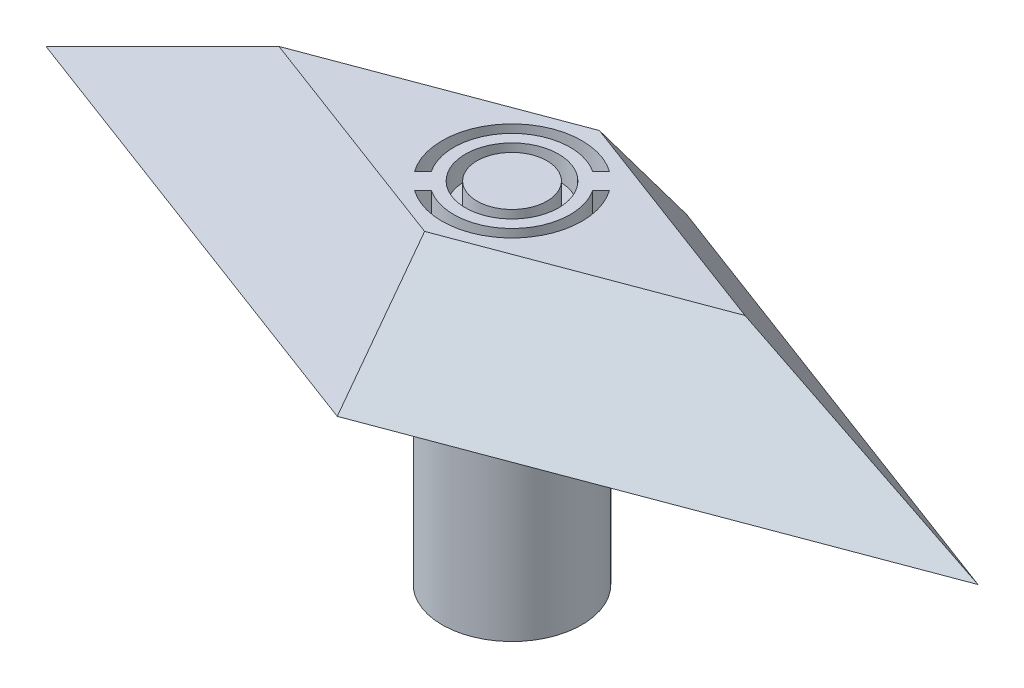
ISO-10303-21;
HEADER;
FILE_DESCRIPTION(('STEP AP214'),'2;1');
FILE_NAME('part.step','',(''),(''),'','','');
FILE_SCHEMA(('AUTOMOTIVE_DESIGN { 1 0 10303 214 1 1 1 1 }'));
ENDSEC;
DATA;
#1=APPLICATION_CONTEXT('core data for automotive mechanical design processes');
#2=APPLICATION_PROTOCOL_DEFINITION('international standard','automotive_design',2000,#1);
#3=PRODUCT_CONTEXT('',#1,'mechanical');
#4=PRODUCT('Part','Part','',(#3));
#5=PRODUCT_RELATED_PRODUCT_CATEGORY('part','',(#4));
#6=PRODUCT_DEFINITION_FORMATION('','',#4);
#7=PRODUCT_DEFINITION_CONTEXT('part definition',#1,'design');
#8=PRODUCT_DEFINITION('design','',#6,#7);
#9=PRODUCT_DEFINITION_SHAPE('','',#8);
#10=(LENGTH_UNIT() NAMED_UNIT(*) SI_UNIT(.MILLI.,.METRE.));
#11=(NAMED_UNIT(*) PLANE_ANGLE_UNIT() SI_UNIT($,.RADIAN.));
#12=(NAMED_UNIT(*) SI_UNIT($,.STERADIAN.) SOLID_ANGLE_UNIT());
#13=UNCERTAINTY_MEASURE_WITH_UNIT(LENGTH_MEASURE(1.E-05),#10,'distance_accuracy_value','');
#14=(GEOMETRIC_REPRESENTATION_CONTEXT(3) GLOBAL_UNCERTAINTY_ASSIGNED_CONTEXT((#13)) GLOBAL_UNIT_ASSIGNED_CONTEXT((#10,
#11,#12)) REPRESENTATION_CONTEXT('',''));
#15=CARTESIAN_POINT('',(0.,0.,0.));
#16=DIRECTION('',(0.,0.,1.));
#17=DIRECTION('',(1.,0.,0.));
#18=AXIS2_PLACEMENT_3D('',#15,#16,#17);
#19=CARTESIAN_POINT('',(0.,5.,0.));
#20=DIRECTION('',(0.,-1.,0.));
#21=DIRECTION('',(1.,0.,0.));
#22=AXIS2_PLACEMENT_3D('',#19,#20,#21);
#23=PLANE('',#22);
#24=CARTESIAN_POINT('',(0.,5.,0.));
#25=DIRECTION('',(0.,-1.,0.));
#26=DIRECTION('',(1.,0.,0.));
#27=AXIS2_PLACEMENT_3D('',#24,#25,#26);
#28=CIRCLE('',#27,2.);
#29=CARTESIAN_POINT('',(2.00000000000004,4.99999999999999,0.));
#30=VERTEX_POINT('',#29);
#31=EDGE_CURVE('E450',#30,#30,#28,.T.);
#32=ORIENTED_EDGE('',*,*,#31,.T.);
#33=EDGE_LOOP('',(#32));
#34=FACE_BOUND('',#33,.T.);
#35=CARTESIAN_POINT('',(0.,5.,0.));
#36=DIRECTION('',(0.,-1.,0.));
#37=DIRECTION('',(1.,0.,0.));
#38=AXIS2_PLACEMENT_3D('',#35,#36,#37);
#39=CIRCLE('',#38,3.);
#40=CARTESIAN_POINT('',(2.4452034569285,4.99999999999998,-1.73809667574192));
#41=VERTEX_POINT('',#40);
#42=CARTESIAN_POINT('',(-1.73809667574188,5.00000000000001,2.44520345692846));
#43=VERTEX_POINT('',#42);
#44=EDGE_CURVE('E69',#41,#43,#39,.T.);
#45=ORIENTED_EDGE('',*,*,#44,.T.);
#46=DIRECTION('',(0.707106781186547,0.,-0.707106781186548));
#47=VECTOR('',#46,1.);
#48=CARTESIAN_POINT('',(-1.37849741697557,5.00000000000001,2.08560419816215));
#49=LINE('',#48,#47);
#50=CARTESIAN_POINT('',(-1.37849741697557,5.00000000000001,2.08560419816215));
#51=VERTEX_POINT('',#50);
#52=EDGE_CURVE('E171',#43,#51,#49,.T.);
#53=ORIENTED_EDGE('',*,*,#52,.T.);
#54=CARTESIAN_POINT('',(0.,5.,0.));
#55=DIRECTION('',(0.,1.,0.));
#56=DIRECTION('',(1.,0.,0.));
#57=AXIS2_PLACEMENT_3D('',#54,#55,#56);
#58=CIRCLE('',#57,2.5);
#59=CARTESIAN_POINT('',(2.08560419816218,4.99999999999999,-1.3784974169756));
#60=VERTEX_POINT('',#59);
#61=EDGE_CURVE('E190',#51,#60,#58,.T.);
#62=ORIENTED_EDGE('',*,*,#61,.T.);
#63=DIRECTION('',(0.707106781186548,0.,-0.707106781186547));
#64=VECTOR('',#63,1.);
#65=CARTESIAN_POINT('',(2.4452034569285,4.99999999999998,-1.73809667574192));
#66=LINE('',#65,#64);
#67=EDGE_CURVE('E181',#60,#41,#66,.T.);
#68=ORIENTED_EDGE('',*,*,#67,.T.);
#69=EDGE_LOOP('',(#45,#53,#62,#68));
#70=FACE_BOUND('',#69,.T.);
#71=DIRECTION('',(0.936329177569045,0.,-0.351123441588392));
#72=VECTOR('',#71,1.);
#73=CARTESIAN_POINT('',(-10.,5.00000000000007,0.));
#74=LINE('',#73,#72);
#75=CARTESIAN_POINT('',(-10.,5.00000000000007,0.));
#76=VERTEX_POINT('',#75);
#77=CARTESIAN_POINT('',(0.,5.,-3.75));
#78=VERTEX_POINT('',#77);
#79=EDGE_CURVE('E313',#76,#78,#74,.T.);
#80=ORIENTED_EDGE('',*,*,#79,.F.);
#81=DIRECTION('',(-0.936329177569045,0.,-0.351123441588392));
#82=VECTOR('',#81,1.);
#83=CARTESIAN_POINT('',(0.,5.,3.75));
#84=LINE('',#83,#82);
#85=CARTESIAN_POINT('',(0.,5.,3.75));
#86=VERTEX_POINT('',#85);
#87=EDGE_CURVE('E12',#86,#76,#84,.T.);
#88=ORIENTED_EDGE('',*,*,#87,.F.);
#89=DIRECTION('',(-0.936329177569045,0.,0.351123441588392));
#90=VECTOR('',#89,1.);
#91=CARTESIAN_POINT('',(10.,4.99999999999993,0.));
#92=LINE('',#91,#90);
#93=CARTESIAN_POINT('',(10.,4.99999999999993,0.));
#94=VERTEX_POINT('',#93);
#95=EDGE_CURVE('E53',#94,#86,#92,.T.);
#96=ORIENTED_EDGE('',*,*,#95,.F.);
#97=DIRECTION('',(0.936329177569045,0.,0.351123441588392));
#98=VECTOR('',#97,1.);
#99=CARTESIAN_POINT('',(0.,5.,-3.75));
#100=LINE('',#99,#98);
#101=EDGE_CURVE('E265',#78,#94,#100,.T.);
#102=ORIENTED_EDGE('',*,*,#101,.F.);
#103=EDGE_LOOP('',(#80,#88,#96,#102));
#104=FACE_BOUND('',#103,.T.);
#105=CARTESIAN_POINT('',(0.,5.,0.));
#106=DIRECTION('',(0.,1.,0.));
#107=DIRECTION('',(1.,0.,0.));
#108=AXIS2_PLACEMENT_3D('',#105,#106,#107);
#109=CIRCLE('',#108,2.5);
#110=CARTESIAN_POINT('',(1.37849741697564,4.99999999999999,-2.08560419816215));
#111=VERTEX_POINT('',#110);
#112=CARTESIAN_POINT('',(-2.08560419816212,5.00000000000002,1.3784974169756));
#113=VERTEX_POINT('',#112);
#114=EDGE_CURVE('E61',#111,#113,#109,.T.);
#115=ORIENTED_EDGE('',*,*,#114,.T.);
#116=DIRECTION('',(-0.707106781186548,0.,0.707106781186547));
#117=VECTOR('',#116,1.);
#118=CARTESIAN_POINT('',(-2.08560419816212,5.00000000000002,1.3784974169756));
#119=LINE('',#118,#117);
#120=CARTESIAN_POINT('',(-2.44520345692843,5.00000000000002,1.73809667574191));
#121=VERTEX_POINT('',#120);
#122=EDGE_CURVE('E168',#113,#121,#119,.T.);
#123=ORIENTED_EDGE('',*,*,#122,.T.);
#124=CARTESIAN_POINT('',(0.,5.,0.));
#125=DIRECTION('',(0.,-1.,0.));
#126=DIRECTION('',(1.,0.,0.));
#127=AXIS2_PLACEMENT_3D('',#124,#125,#126);
#128=CIRCLE('',#127,3.);
#129=CARTESIAN_POINT('',(1.73809667574195,4.99999999999999,-2.44520345692846));
#130=VERTEX_POINT('',#129);
#131=EDGE_CURVE('E462',#121,#130,#128,.T.);
#132=ORIENTED_EDGE('',*,*,#131,.T.);
#133=DIRECTION('',(-0.707106781186548,0.,0.707106781186547));
#134=VECTOR('',#133,1.);
#135=CARTESIAN_POINT('',(1.73809667574195,4.99999999999999,-2.44520345692846));
#136=LINE('',#135,#134);
#137=EDGE_CURVE('E164',#130,#111,#136,.T.);
#138=ORIENTED_EDGE('',*,*,#137,.T.);
#139=EDGE_LOOP('',(#115,#123,#132,#138));
#140=FACE_BOUND('',#139,.T.);
#141=ADVANCED_FACE('F43',(#34,#70,#104,#140),#23,.F.);
#142=CARTESIAN_POINT('',(0.,0.,0.));
#143=DIRECTION('',(0.,-1.,0.));
#144=DIRECTION('',(0.,0.,-1.));
#145=AXIS2_PLACEMENT_3D('',#142,#143,#144);
#146=PLANE('',#145);
#147=CARTESIAN_POINT('',(0.,0.,0.));
#148=DIRECTION('',(0.,1.,0.));
#149=DIRECTION('',(0.,0.,1.));
#150=AXIS2_PLACEMENT_3D('',#147,#148,#149);
#151=CIRCLE('',#150,3.);
#152=CARTESIAN_POINT('',(-2.,0.,2.23606797749979));
#153=VERTEX_POINT('',#152);
#154=CARTESIAN_POINT('',(-2.,0.,-2.23606797749979));
#155=VERTEX_POINT('',#154);
#156=EDGE_CURVE('E202',#153,#155,#151,.T.);
#157=ORIENTED_EDGE('',*,*,#156,.T.);
#158=DIRECTION('',(0.,0.,1.));
#159=VECTOR('',#158,1.);
#160=CARTESIAN_POINT('',(-2.,0.,2.23606797749979));
#161=LINE('',#160,#159);
#162=EDGE_CURVE('E207',#155,#153,#161,.T.);
#163=ORIENTED_EDGE('',*,*,#162,.T.);
#164=EDGE_LOOP('',(#157,#163));
#165=FACE_BOUND('',#164,.T.);
#166=DIRECTION('',(0.936329177569045,0.,0.351123441588392));
#167=VECTOR('',#166,1.);
#168=CARTESIAN_POINT('',(0.,0.,7.5));
#169=LINE('',#168,#167);
#170=CARTESIAN_POINT('',(-20.,0.,0.));
#171=VERTEX_POINT('',#170);
#172=CARTESIAN_POINT('',(0.,0.,7.5));
#173=VERTEX_POINT('',#172);
#174=EDGE_CURVE('E216',#171,#173,#169,.T.);
#175=ORIENTED_EDGE('',*,*,#174,.F.);
#176=DIRECTION('',(-0.936329177569045,0.,0.351123441588392));
#177=VECTOR('',#176,1.);
#178=CARTESIAN_POINT('',(-20.,0.,0.));
#179=LINE('',#178,#177);
#180=CARTESIAN_POINT('',(0.,0.,-7.5));
#181=VERTEX_POINT('',#180);
#182=EDGE_CURVE('E302',#181,#171,#179,.T.);
#183=ORIENTED_EDGE('',*,*,#182,.F.);
#184=DIRECTION('',(-0.936329177569045,0.,-0.351123441588392));
#185=VECTOR('',#184,1.);
#186=CARTESIAN_POINT('',(0.,0.,-7.5));
#187=LINE('',#186,#185);
#188=CARTESIAN_POINT('',(20.,0.,0.));
#189=VERTEX_POINT('',#188);
#190=EDGE_CURVE('E375',#189,#181,#187,.T.);
#191=ORIENTED_EDGE('',*,*,#190,.F.);
#192=DIRECTION('',(0.936329177569045,0.,-0.351123441588392));
#193=VECTOR('',#192,1.);
#194=CARTESIAN_POINT('',(20.,0.,0.));
#195=LINE('',#194,#193);
#196=EDGE_CURVE('E224',#173,#189,#195,.T.);
#197=ORIENTED_EDGE('',*,*,#196,.F.);
#198=EDGE_LOOP('',(#175,#183,#191,#197));
#199=FACE_BOUND('',#198,.T.);
#200=ADVANCED_FACE('F243',(#165,#199),#146,.T.);
#201=CARTESIAN_POINT('',(1.65137614678897,3.30275229357799,4.40366972477065));
#202=DIRECTION('',(-0.287347885566342,-0.574695771132692,-0.766261028176922));
#203=DIRECTION('',(0.,0.8,-0.6));
#204=AXIS2_PLACEMENT_3D('',#201,#202,#203);
#205=PLANE('',#204);
#206=DIRECTION('',(-0.894427190999919,0.447213595499953,0.));
#207=VECTOR('',#206,1.);
#208=CARTESIAN_POINT('',(20.,0.,0.));
#209=LINE('',#208,#207);
#210=EDGE_CURVE('E395',#189,#94,#209,.T.);
#211=ORIENTED_EDGE('',*,*,#210,.T.);
#212=ORIENTED_EDGE('',*,*,#95,.T.);
#213=DIRECTION('',(0.,0.8,-0.6));
#214=VECTOR('',#213,1.);
#215=CARTESIAN_POINT('',(0.,0.,7.5));
#216=LINE('',#215,#214);
#217=EDGE_CURVE('E230',#173,#86,#216,.T.);
#218=ORIENTED_EDGE('',*,*,#217,.F.);
#219=ORIENTED_EDGE('',*,*,#196,.T.);
#220=EDGE_LOOP('',(#211,#212,#218,#219));
#221=FACE_BOUND('',#220,.T.);
#222=ADVANCED_FACE('F232',(#221),#205,.F.);
#223=CARTESIAN_POINT('',(-1.65137614678897,3.30275229357799,4.40366972477065));
#224=DIRECTION('',(-0.287347885566342,0.574695771132691,0.766261028176922));
#225=DIRECTION('',(0.,-0.8,0.6));
#226=AXIS2_PLACEMENT_3D('',#223,#224,#225);
#227=PLANE('',#226);
#228=ORIENTED_EDGE('',*,*,#217,.T.);
#229=ORIENTED_EDGE('',*,*,#87,.T.);
#230=DIRECTION('',(0.894427190999913,0.447213595499963,0.));
#231=VECTOR('',#230,1.);
#232=CARTESIAN_POINT('',(-20.,0.,0.));
#233=LINE('',#232,#231);
#234=EDGE_CURVE('E295',#171,#76,#233,.T.);
#235=ORIENTED_EDGE('',*,*,#234,.F.);
#236=ORIENTED_EDGE('',*,*,#174,.T.);
#237=EDGE_LOOP('',(#228,#229,#235,#236));
#238=FACE_BOUND('',#237,.T.);
#239=ADVANCED_FACE('F242',(#238),#227,.T.);
#240=CARTESIAN_POINT('',(1.65137614678901,3.30275229357798,-4.40366972477063));
#241=DIRECTION('',(0.287347885566349,0.57469577113269,-0.76626102817692));
#242=DIRECTION('',(0.,0.8,0.6));
#243=AXIS2_PLACEMENT_3D('',#240,#241,#242);
#244=PLANE('',#243);
#245=DIRECTION('',(0.,0.8,0.6));
#246=VECTOR('',#245,1.);
#247=CARTESIAN_POINT('',(0.,0.,-7.5));
#248=LINE('',#247,#246);
#249=EDGE_CURVE('E288',#181,#78,#248,.T.);
#250=ORIENTED_EDGE('',*,*,#249,.T.);
#251=ORIENTED_EDGE('',*,*,#101,.T.);
#252=ORIENTED_EDGE('',*,*,#210,.F.);
#253=ORIENTED_EDGE('',*,*,#190,.T.);
#254=EDGE_LOOP('',(#250,#251,#252,#253));
#255=FACE_BOUND('',#254,.T.);
#256=ADVANCED_FACE('F271',(#255),#244,.T.);
#257=CARTESIAN_POINT('',(-1.65137614678901,3.30275229357797,-4.40366972477063));
#258=DIRECTION('',(0.287347885566349,-0.57469577113269,0.766261028176921));
#259=DIRECTION('',(0.,-0.8,-0.6));
#260=AXIS2_PLACEMENT_3D('',#257,#258,#259);
#261=PLANE('',#260);
#262=ORIENTED_EDGE('',*,*,#234,.T.);
#263=ORIENTED_EDGE('',*,*,#79,.T.);
#264=ORIENTED_EDGE('',*,*,#249,.F.);
#265=ORIENTED_EDGE('',*,*,#182,.T.);
#266=EDGE_LOOP('',(#262,#263,#264,#265));
#267=FACE_BOUND('',#266,.T.);
#268=ADVANCED_FACE('F279',(#267),#261,.F.);
#269=CARTESIAN_POINT('',(0.,-10.,0.));
#270=DIRECTION('',(0.,1.,0.));
#271=DIRECTION('',(0.,0.,1.));
#272=AXIS2_PLACEMENT_3D('',#269,#270,#271);
#273=CYLINDRICAL_SURFACE('',#272,3.);
#274=ORIENTED_EDGE('',*,*,#156,.F.);
#275=DIRECTION('',(0.,1.,0.));
#276=VECTOR('',#275,1.);
#277=CARTESIAN_POINT('',(-2.,-10.,2.23606797749979));
#278=LINE('',#277,#276);
#279=CARTESIAN_POINT('',(-2.,-10.,2.23606797749979));
#280=VERTEX_POINT('',#279);
#281=EDGE_CURVE('E213',#280,#153,#278,.T.);
#282=ORIENTED_EDGE('',*,*,#281,.F.);
#283=CARTESIAN_POINT('',(0.,-10.,0.));
#284=DIRECTION('',(0.,1.,0.));
#285=DIRECTION('',(0.,0.,1.));
#286=AXIS2_PLACEMENT_3D('',#283,#284,#285);
#287=CIRCLE('',#286,3.);
#288=CARTESIAN_POINT('',(-2.,-10.,-2.23606797749979));
#289=VERTEX_POINT('',#288);
#290=EDGE_CURVE('E203',#280,#289,#287,.T.);
#291=ORIENTED_EDGE('',*,*,#290,.T.);
#292=DIRECTION('',(0.,1.,0.));
#293=VECTOR('',#292,1.);
#294=CARTESIAN_POINT('',(-2.,-10.,-2.23606797749979));
#295=LINE('',#294,#293);
#296=EDGE_CURVE('E210',#289,#155,#295,.T.);
#297=ORIENTED_EDGE('',*,*,#296,.T.);
#298=EDGE_LOOP('',(#274,#282,#291,#297));
#299=FACE_BOUND('',#298,.T.);
#300=ADVANCED_FACE('F419',(#299),#273,.T.);
#301=CARTESIAN_POINT('',(-2.,-10.,2.23606797749979));
#302=DIRECTION('',(-1.,0.,0.));
#303=DIRECTION('',(0.,0.,1.));
#304=AXIS2_PLACEMENT_3D('',#301,#302,#303);
#305=PLANE('',#304);
#306=ORIENTED_EDGE('',*,*,#162,.F.);
#307=ORIENTED_EDGE('',*,*,#296,.F.);
#308=DIRECTION('',(0.,0.,1.));
#309=VECTOR('',#308,1.);
#310=CARTESIAN_POINT('',(-2.,-10.,2.23606797749979));
#311=LINE('',#310,#309);
#312=EDGE_CURVE('E206',#289,#280,#311,.T.);
#313=ORIENTED_EDGE('',*,*,#312,.T.);
#314=ORIENTED_EDGE('',*,*,#281,.T.);
#315=EDGE_LOOP('',(#306,#307,#313,#314));
#316=FACE_BOUND('',#315,.T.);
#317=ADVANCED_FACE('F423',(#316),#305,.T.);
#318=CARTESIAN_POINT('',(0.,-10.,0.));
#319=DIRECTION('',(0.,1.,0.));
#320=DIRECTION('',(0.,0.,1.));
#321=AXIS2_PLACEMENT_3D('',#318,#319,#320);
#322=PLANE('',#321);
#323=ORIENTED_EDGE('',*,*,#290,.F.);
#324=ORIENTED_EDGE('',*,*,#312,.F.);
#325=EDGE_LOOP('',(#323,#324));
#326=FACE_BOUND('',#325,.T.);
#327=ADVANCED_FACE('F508',(#326),#322,.F.);
#328=CARTESIAN_POINT('',(0.,4.,0.));
#329=DIRECTION('',(0.,1.,0.));
#330=DIRECTION('',(-1.,0.,0.));
#331=AXIS2_PLACEMENT_3D('',#328,#329,#330);
#332=CYLINDRICAL_SURFACE('',#331,3.);
#333=ORIENTED_EDGE('',*,*,#44,.F.);
#334=DIRECTION('',(0.,1.,0.));
#335=VECTOR('',#334,1.);
#336=CARTESIAN_POINT('',(2.44520345692849,3.99999999999998,-1.73809667574192));
#337=LINE('',#336,#335);
#338=CARTESIAN_POINT('',(2.44520345692849,3.99999999999998,-1.73809667574192));
#339=VERTEX_POINT('',#338);
#340=EDGE_CURVE('E186',#339,#41,#337,.T.);
#341=ORIENTED_EDGE('',*,*,#340,.F.);
#342=CARTESIAN_POINT('',(0.,4.,0.));
#343=DIRECTION('',(0.,-1.,0.));
#344=DIRECTION('',(1.,0.,0.));
#345=AXIS2_PLACEMENT_3D('',#342,#343,#344);
#346=CIRCLE('',#345,3.);
#347=CARTESIAN_POINT('',(-1.73809667574189,4.00000000000001,2.44520345692846));
#348=VERTEX_POINT('',#347);
#349=EDGE_CURVE('E177',#339,#348,#346,.T.);
#350=ORIENTED_EDGE('',*,*,#349,.T.);
#351=DIRECTION('',(0.,1.,0.));
#352=VECTOR('',#351,1.);
#353=CARTESIAN_POINT('',(-1.73809667574189,4.00000000000001,2.44520345692846));
#354=LINE('',#353,#352);
#355=EDGE_CURVE('E200',#348,#43,#354,.T.);
#356=ORIENTED_EDGE('',*,*,#355,.T.);
#357=EDGE_LOOP('',(#333,#341,#350,#356));
#358=FACE_BOUND('',#357,.T.);
#359=ADVANCED_FACE('F504',(#358),#332,.F.);
#360=CARTESIAN_POINT('',(-1.37849741697558,4.00000000000001,2.08560419816215));
#361=DIRECTION('',(0.707106781186548,0.,0.707106781186547));
#362=DIRECTION('',(0.707106781186547,0.,-0.707106781186548));
#363=AXIS2_PLACEMENT_3D('',#360,#361,#362);
#364=PLANE('',#363);
#365=ORIENTED_EDGE('',*,*,#52,.F.);
#366=ORIENTED_EDGE('',*,*,#355,.F.);
#367=DIRECTION('',(0.707106781186547,0.,-0.707106781186548));
#368=VECTOR('',#367,1.);
#369=CARTESIAN_POINT('',(-1.37849741697558,4.00000000000001,2.08560419816215));
#370=LINE('',#369,#368);
#371=CARTESIAN_POINT('',(-1.37849741697558,4.00000000000001,2.08560419816215));
#372=VERTEX_POINT('',#371);
#373=EDGE_CURVE('E180',#348,#372,#370,.T.);
#374=ORIENTED_EDGE('',*,*,#373,.T.);
#375=DIRECTION('',(0.,1.,0.));
#376=VECTOR('',#375,1.);
#377=CARTESIAN_POINT('',(-1.37849741697558,4.00000000000001,2.08560419816215));
#378=LINE('',#377,#376);
#379=EDGE_CURVE('E198',#372,#51,#378,.T.);
#380=ORIENTED_EDGE('',*,*,#379,.T.);
#381=EDGE_LOOP('',(#365,#366,#374,#380));
#382=FACE_BOUND('',#381,.T.);
#383=ADVANCED_FACE('F500',(#382),#364,.T.);
#384=CARTESIAN_POINT('',(0.,4.,0.));
#385=DIRECTION('',(0.,1.,0.));
#386=DIRECTION('',(-1.,0.,0.));
#387=AXIS2_PLACEMENT_3D('',#384,#385,#386);
#388=CYLINDRICAL_SURFACE('',#387,2.5);
#389=ORIENTED_EDGE('',*,*,#61,.F.);
#390=ORIENTED_EDGE('',*,*,#379,.F.);
#391=CARTESIAN_POINT('',(0.,4.,0.));
#392=DIRECTION('',(0.,1.,0.));
#393=DIRECTION('',(1.,0.,0.));
#394=AXIS2_PLACEMENT_3D('',#391,#392,#393);
#395=CIRCLE('',#394,2.5);
#396=CARTESIAN_POINT('',(2.08560419816218,3.99999999999999,-1.3784974169756));
#397=VERTEX_POINT('',#396);
#398=EDGE_CURVE('E183',#372,#397,#395,.T.);
#399=ORIENTED_EDGE('',*,*,#398,.T.);
#400=DIRECTION('',(0.,1.,0.));
#401=VECTOR('',#400,1.);
#402=CARTESIAN_POINT('',(2.08560419816218,3.99999999999999,-1.3784974169756));
#403=LINE('',#402,#401);
#404=EDGE_CURVE('E196',#397,#60,#403,.T.);
#405=ORIENTED_EDGE('',*,*,#404,.T.);
#406=EDGE_LOOP('',(#389,#390,#399,#405));
#407=FACE_BOUND('',#406,.T.);
#408=ADVANCED_FACE('F496',(#407),#388,.T.);
#409=CARTESIAN_POINT('',(2.44520345692849,3.99999999999998,-1.73809667574192));
#410=DIRECTION('',(0.707106781186547,0.,0.707106781186548));
#411=DIRECTION('',(0.707106781186548,0.,-0.707106781186547));
#412=AXIS2_PLACEMENT_3D('',#409,#410,#411);
#413=PLANE('',#412);
#414=ORIENTED_EDGE('',*,*,#67,.F.);
#415=ORIENTED_EDGE('',*,*,#404,.F.);
#416=DIRECTION('',(0.707106781186548,0.,-0.707106781186547));
#417=VECTOR('',#416,1.);
#418=CARTESIAN_POINT('',(2.44520345692849,3.99999999999998,-1.73809667574192));
#419=LINE('',#418,#417);
#420=EDGE_CURVE('E185',#397,#339,#419,.T.);
#421=ORIENTED_EDGE('',*,*,#420,.T.);
#422=ORIENTED_EDGE('',*,*,#340,.T.);
#423=EDGE_LOOP('',(#414,#415,#421,#422));
#424=FACE_BOUND('',#423,.T.);
#425=ADVANCED_FACE('F492',(#424),#413,.T.);
#426=CARTESIAN_POINT('',(0.,4.,0.));
#427=DIRECTION('',(0.,-1.,0.));
#428=DIRECTION('',(1.,0.,0.));
#429=AXIS2_PLACEMENT_3D('',#426,#427,#428);
#430=PLANE('',#429);
#431=ORIENTED_EDGE('',*,*,#349,.F.);
#432=ORIENTED_EDGE('',*,*,#420,.F.);
#433=ORIENTED_EDGE('',*,*,#398,.F.);
#434=ORIENTED_EDGE('',*,*,#373,.F.);
#435=EDGE_LOOP('',(#431,#432,#433,#434));
#436=FACE_BOUND('',#435,.T.);
#437=ADVANCED_FACE('F489',(#436),#430,.F.);
#438=CARTESIAN_POINT('',(0.,4.,0.));
#439=DIRECTION('',(0.,1.,0.));
#440=DIRECTION('',(-1.,0.,0.));
#441=AXIS2_PLACEMENT_3D('',#438,#439,#440);
#442=CYLINDRICAL_SURFACE('',#441,2.5);
#443=ORIENTED_EDGE('',*,*,#114,.F.);
#444=DIRECTION('',(0.,1.,0.));
#445=VECTOR('',#444,1.);
#446=CARTESIAN_POINT('',(1.37849741697563,3.99999999999999,-2.08560419816215));
#447=LINE('',#446,#445);
#448=CARTESIAN_POINT('',(1.37849741697563,3.99999999999999,-2.08560419816215));
#449=VERTEX_POINT('',#448);
#450=EDGE_CURVE('E163',#449,#111,#447,.T.);
#451=ORIENTED_EDGE('',*,*,#450,.F.);
#452=CARTESIAN_POINT('',(0.,4.,0.));
#453=DIRECTION('',(0.,1.,0.));
#454=DIRECTION('',(1.,0.,0.));
#455=AXIS2_PLACEMENT_3D('',#452,#453,#454);
#456=CIRCLE('',#455,2.5);
#457=CARTESIAN_POINT('',(-2.08560419816212,4.00000000000002,1.3784974169756));
#458=VERTEX_POINT('',#457);
#459=EDGE_CURVE('E155',#449,#458,#456,.T.);
#460=ORIENTED_EDGE('',*,*,#459,.T.);
#461=DIRECTION('',(0.,1.,0.));
#462=VECTOR('',#461,1.);
#463=CARTESIAN_POINT('',(-2.08560419816212,4.00000000000002,1.3784974169756));
#464=LINE('',#463,#462);
#465=EDGE_CURVE('E162',#458,#113,#464,.T.);
#466=ORIENTED_EDGE('',*,*,#465,.T.);
#467=EDGE_LOOP('',(#443,#451,#460,#466));
#468=FACE_BOUND('',#467,.T.);
#469=ADVANCED_FACE('F161',(#468),#442,.T.);
#470=CARTESIAN_POINT('',(-2.08560419816212,4.00000000000002,1.3784974169756));
#471=DIRECTION('',(-0.707106781186547,0.,-0.707106781186548));
#472=DIRECTION('',(-0.707106781186548,0.,0.707106781186547));
#473=AXIS2_PLACEMENT_3D('',#470,#471,#472);
#474=PLANE('',#473);
#475=ORIENTED_EDGE('',*,*,#122,.F.);
#476=ORIENTED_EDGE('',*,*,#465,.F.);
#477=DIRECTION('',(-0.707106781186548,0.,0.707106781186547));
#478=VECTOR('',#477,1.);
#479=CARTESIAN_POINT('',(-2.08560419816212,4.00000000000002,1.3784974169756));
#480=LINE('',#479,#478);
#481=CARTESIAN_POINT('',(-2.44520345692844,4.00000000000002,1.73809667574191));
#482=VERTEX_POINT('',#481);
#483=EDGE_CURVE('E151',#458,#482,#480,.T.);
#484=ORIENTED_EDGE('',*,*,#483,.T.);
#485=DIRECTION('',(0.,1.,0.));
#486=VECTOR('',#485,1.);
#487=CARTESIAN_POINT('',(-2.44520345692844,4.00000000000002,1.73809667574191));
#488=LINE('',#487,#486);
#489=EDGE_CURVE('E169',#482,#121,#488,.T.);
#490=ORIENTED_EDGE('',*,*,#489,.T.);
#491=EDGE_LOOP('',(#475,#476,#484,#490));
#492=FACE_BOUND('',#491,.T.);
#493=ADVANCED_FACE('F166',(#492),#474,.T.);
#494=CARTESIAN_POINT('',(0.,4.,0.));
#495=DIRECTION('',(0.,1.,0.));
#496=DIRECTION('',(-1.,0.,0.));
#497=AXIS2_PLACEMENT_3D('',#494,#495,#496);
#498=CYLINDRICAL_SURFACE('',#497,3.);
#499=ORIENTED_EDGE('',*,*,#131,.F.);
#500=ORIENTED_EDGE('',*,*,#489,.F.);
#501=CARTESIAN_POINT('',(0.,4.,0.));
#502=DIRECTION('',(0.,-1.,0.));
#503=DIRECTION('',(1.,0.,0.));
#504=AXIS2_PLACEMENT_3D('',#501,#502,#503);
#505=CIRCLE('',#504,3.);
#506=CARTESIAN_POINT('',(1.73809667574194,3.99999999999999,-2.44520345692846));
#507=VERTEX_POINT('',#506);
#508=EDGE_CURVE('E156',#482,#507,#505,.T.);
#509=ORIENTED_EDGE('',*,*,#508,.T.);
#510=DIRECTION('',(0.,1.,0.));
#511=VECTOR('',#510,1.);
#512=CARTESIAN_POINT('',(1.73809667574194,3.99999999999999,-2.44520345692846));
#513=LINE('',#512,#511);
#514=EDGE_CURVE('E173',#507,#130,#513,.T.);
#515=ORIENTED_EDGE('',*,*,#514,.T.);
#516=EDGE_LOOP('',(#499,#500,#509,#515));
#517=FACE_BOUND('',#516,.T.);
#518=ADVANCED_FACE('F471',(#517),#498,.F.);
#519=CARTESIAN_POINT('',(1.73809667574194,3.99999999999999,-2.44520345692846));
#520=DIRECTION('',(-0.707106781186547,0.,-0.707106781186548));
#521=DIRECTION('',(-0.707106781186548,0.,0.707106781186547));
#522=AXIS2_PLACEMENT_3D('',#519,#520,#521);
#523=PLANE('',#522);
#524=ORIENTED_EDGE('',*,*,#137,.F.);
#525=ORIENTED_EDGE('',*,*,#514,.F.);
#526=DIRECTION('',(-0.707106781186548,0.,0.707106781186547));
#527=VECTOR('',#526,1.);
#528=CARTESIAN_POINT('',(1.73809667574194,3.99999999999999,-2.44520345692846));
#529=LINE('',#528,#527);
#530=EDGE_CURVE('E458',#507,#449,#529,.T.);
#531=ORIENTED_EDGE('',*,*,#530,.T.);
#532=ORIENTED_EDGE('',*,*,#450,.T.);
#533=EDGE_LOOP('',(#524,#525,#531,#532));
#534=FACE_BOUND('',#533,.T.);
#535=ADVANCED_FACE('F473',(#534),#523,.T.);
#536=CARTESIAN_POINT('',(0.,4.,0.));
#537=DIRECTION('',(0.,-1.,0.));
#538=DIRECTION('',(1.,0.,0.));
#539=AXIS2_PLACEMENT_3D('',#536,#537,#538);
#540=PLANE('',#539);
#541=ORIENTED_EDGE('',*,*,#459,.F.);
#542=ORIENTED_EDGE('',*,*,#530,.F.);
#543=ORIENTED_EDGE('',*,*,#508,.F.);
#544=ORIENTED_EDGE('',*,*,#483,.F.);
#545=EDGE_LOOP('',(#541,#542,#543,#544));
#546=FACE_BOUND('',#545,.T.);
#547=ADVANCED_FACE('F153',(#546),#540,.F.);
#548=CARTESIAN_POINT('',(0.,4.,0.));
#549=DIRECTION('',(0.,-1.,0.));
#550=DIRECTION('',(1.,0.,0.));
#551=AXIS2_PLACEMENT_3D('',#548,#549,#550);
#552=PLANE('',#551);
#553=CARTESIAN_POINT('',(0.,4.,0.));
#554=DIRECTION('',(0.,-1.,0.));
#555=DIRECTION('',(1.,0.,0.));
#556=AXIS2_PLACEMENT_3D('',#553,#554,#555);
#557=CIRCLE('',#556,2.);
#558=CARTESIAN_POINT('',(2.00000000000003,3.99999999999999,0.));
#559=VERTEX_POINT('',#558);
#560=EDGE_CURVE('E453',#559,#559,#557,.T.);
#561=ORIENTED_EDGE('',*,*,#560,.F.);
#562=EDGE_LOOP('',(#561));
#563=FACE_BOUND('',#562,.T.);
#564=CARTESIAN_POINT('',(0.,4.,0.));
#565=DIRECTION('',(0.,-1.,0.));
#566=DIRECTION('',(1.,0.,0.));
#567=AXIS2_PLACEMENT_3D('',#564,#565,#566);
#568=CIRCLE('',#567,1.5);
#569=CARTESIAN_POINT('',(1.50000000000003,3.99999999999999,0.));
#570=VERTEX_POINT('',#569);
#571=EDGE_CURVE('E447',#570,#570,#568,.T.);
#572=ORIENTED_EDGE('',*,*,#571,.T.);
#573=EDGE_LOOP('',(#572));
#574=FACE_BOUND('',#573,.T.);
#575=ADVANCED_FACE('F480',(#563,#574),#552,.F.);
#576=CARTESIAN_POINT('',(0.,4.,0.));
#577=DIRECTION('',(0.,1.,0.));
#578=DIRECTION('',(-1.,0.,0.));
#579=AXIS2_PLACEMENT_3D('',#576,#577,#578);
#580=CYLINDRICAL_SURFACE('',#579,2.);
#581=ORIENTED_EDGE('',*,*,#560,.T.);
#582=EDGE_LOOP('',(#581));
#583=FACE_BOUND('',#582,.T.);
#584=ORIENTED_EDGE('',*,*,#31,.F.);
#585=EDGE_LOOP('',(#584));
#586=FACE_BOUND('',#585,.T.);
#587=ADVANCED_FACE('F440',(#583,#586),#580,.F.);
#588=CARTESIAN_POINT('',(0.,4.,0.));
#589=DIRECTION('',(0.,1.,0.));
#590=DIRECTION('',(-1.,0.,0.));
#591=AXIS2_PLACEMENT_3D('',#588,#589,#590);
#592=CYLINDRICAL_SURFACE('',#591,1.5);
#593=ORIENTED_EDGE('',*,*,#571,.F.);
#594=EDGE_LOOP('',(#593));
#595=FACE_BOUND('',#594,.T.);
#596=CARTESIAN_POINT('',(0.,5.,0.));
#597=DIRECTION('',(0.,-1.,0.));
#598=DIRECTION('',(1.,0.,0.));
#599=AXIS2_PLACEMENT_3D('',#596,#597,#598);
#600=CIRCLE('',#599,1.5);
#601=CARTESIAN_POINT('',(1.50000000000004,4.99999999999999,0.));
#602=VERTEX_POINT('',#601);
#603=EDGE_CURVE('E445',#602,#602,#600,.T.);
#604=ORIENTED_EDGE('',*,*,#603,.T.);
#605=EDGE_LOOP('',(#604));
#606=FACE_BOUND('',#605,.T.);
#607=ADVANCED_FACE('F435',(#595,#606),#592,.T.);
#608=ORIENTED_EDGE('',*,*,#603,.F.);
#609=EDGE_LOOP('',(#608));
#610=FACE_BOUND('',#609,.T.);
#611=ADVANCED_FACE('F427',(#610),#23,.F.);
#612=CLOSED_SHELL('',(#141,#200,#222,#239,#256,#268,#300,#317,#327,#359,#383,#408,#425,#437,
#469,#493,#518,#535,#547,#575,#587,#607,#611));
#613=MANIFOLD_SOLID_BREP('B2',#612);
#614=ADVANCED_BREP_SHAPE_REPRESENTATION('',(#18,#613),#14);
#615=SHAPE_DEFINITION_REPRESENTATION(#9,#614);
ENDSEC;
END-ISO-10303-21;
